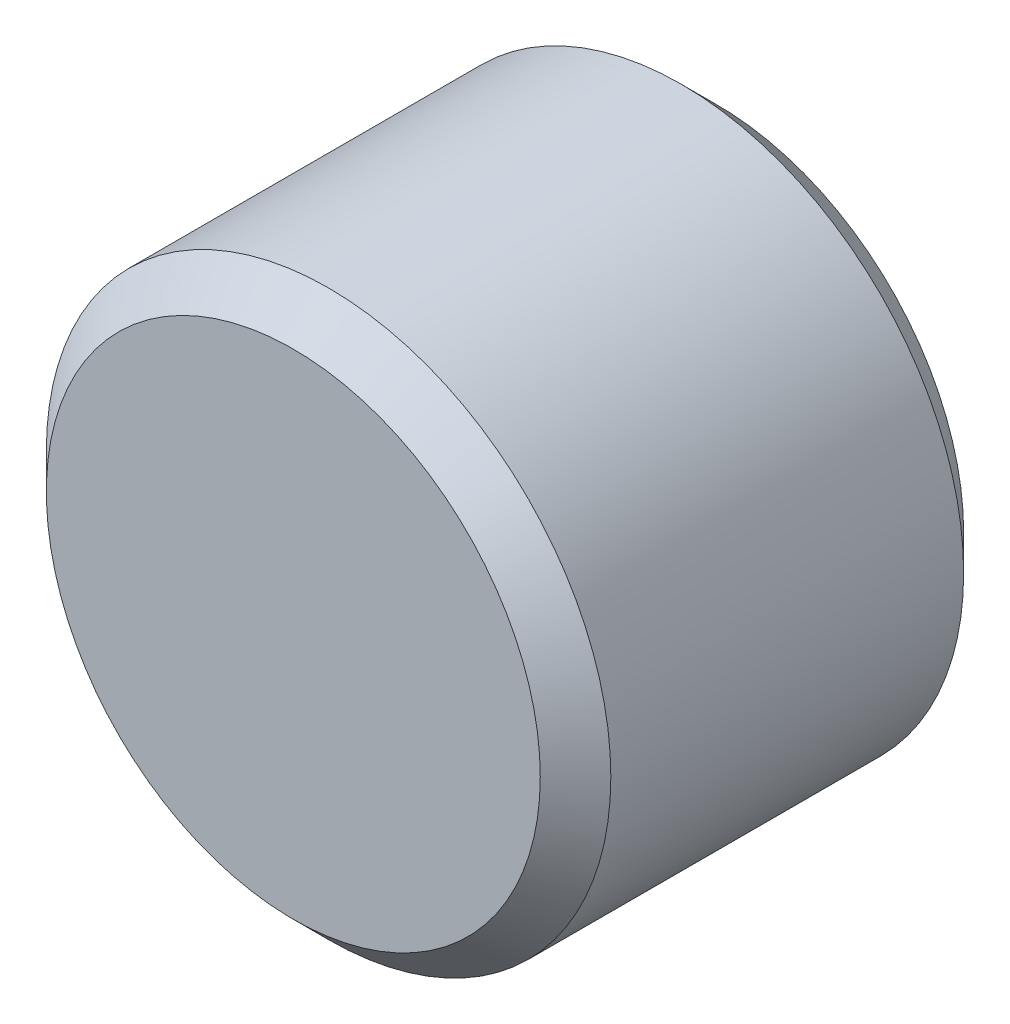
ISO-10303-21;
HEADER;
FILE_DESCRIPTION(('STEP AP214'),'2;1');
FILE_NAME('part.step','',(''),(''),'','','');
FILE_SCHEMA(('AUTOMOTIVE_DESIGN { 1 0 10303 214 1 1 1 1 }'));
ENDSEC;
DATA;
#1=APPLICATION_CONTEXT('core data for automotive mechanical design processes');
#2=APPLICATION_PROTOCOL_DEFINITION('international standard','automotive_design',2000,#1);
#3=PRODUCT_CONTEXT('',#1,'mechanical');
#4=PRODUCT('Part','Part','',(#3));
#5=PRODUCT_RELATED_PRODUCT_CATEGORY('part','',(#4));
#6=PRODUCT_DEFINITION_FORMATION('','',#4);
#7=PRODUCT_DEFINITION_CONTEXT('part definition',#1,'design');
#8=PRODUCT_DEFINITION('design','',#6,#7);
#9=PRODUCT_DEFINITION_SHAPE('','',#8);
#10=(LENGTH_UNIT() NAMED_UNIT(*) SI_UNIT(.MILLI.,.METRE.));
#11=(NAMED_UNIT(*) PLANE_ANGLE_UNIT() SI_UNIT($,.RADIAN.));
#12=(NAMED_UNIT(*) SI_UNIT($,.STERADIAN.) SOLID_ANGLE_UNIT());
#13=UNCERTAINTY_MEASURE_WITH_UNIT(LENGTH_MEASURE(1.E-05),#10,'distance_accuracy_value','');
#14=(GEOMETRIC_REPRESENTATION_CONTEXT(3) GLOBAL_UNCERTAINTY_ASSIGNED_CONTEXT((#13)) GLOBAL_UNIT_ASSIGNED_CONTEXT((#10,
#11,#12)) REPRESENTATION_CONTEXT('',''));
#15=CARTESIAN_POINT('',(0.,0.,0.));
#16=DIRECTION('',(0.,0.,1.));
#17=DIRECTION('',(1.,0.,0.));
#18=AXIS2_PLACEMENT_3D('',#15,#16,#17);
#19=CARTESIAN_POINT('',(0.,0.,6.));
#20=DIRECTION('',(0.,0.,-1.));
#21=DIRECTION('',(-1.,0.,0.));
#22=AXIS2_PLACEMENT_3D('',#19,#20,#21);
#23=CYLINDRICAL_SURFACE('',#22,4.);
#24=CARTESIAN_POINT('',(0.,0.,0.500000000000001));
#25=DIRECTION('',(0.,0.,1.));
#26=DIRECTION('',(1.,0.,0.));
#27=AXIS2_PLACEMENT_3D('',#24,#25,#26);
#28=CIRCLE('',#27,4.);
#29=CARTESIAN_POINT('',(4.,0.,0.500000000000001));
#30=VERTEX_POINT('',#29);
#31=EDGE_CURVE('E51',#30,#30,#28,.T.);
#32=ORIENTED_EDGE('',*,*,#31,.T.);
#33=EDGE_LOOP('',(#32));
#34=FACE_BOUND('',#33,.T.);
#35=CARTESIAN_POINT('',(0.,0.,5.5));
#36=DIRECTION('',(0.,0.,1.));
#37=DIRECTION('',(1.,0.,0.));
#38=AXIS2_PLACEMENT_3D('',#35,#36,#37);
#39=CIRCLE('',#38,4.);
#40=CARTESIAN_POINT('',(4.,0.,5.5));
#41=VERTEX_POINT('',#40);
#42=EDGE_CURVE('E55',#41,#41,#39,.F.);
#43=ORIENTED_EDGE('',*,*,#42,.T.);
#44=EDGE_LOOP('',(#43));
#45=FACE_BOUND('',#44,.T.);
#46=ADVANCED_FACE('F39',(#34,#45),#23,.T.);
#47=CARTESIAN_POINT('',(0.,0.,6.));
#48=DIRECTION('',(0.,0.,1.));
#49=DIRECTION('',(1.,0.,0.));
#50=AXIS2_PLACEMENT_3D('',#47,#48,#49);
#51=PLANE('',#50);
#52=CARTESIAN_POINT('',(0.,0.,6.));
#53=DIRECTION('',(0.,0.,1.));
#54=DIRECTION('',(1.,0.,0.));
#55=AXIS2_PLACEMENT_3D('',#52,#53,#54);
#56=CIRCLE('',#55,3.5);
#57=CARTESIAN_POINT('',(3.5,0.,6.));
#58=VERTEX_POINT('',#57);
#59=EDGE_CURVE('E10',#58,#58,#56,.T.);
#60=ORIENTED_EDGE('',*,*,#59,.T.);
#61=EDGE_LOOP('',(#60));
#62=FACE_BOUND('',#61,.T.);
#63=ADVANCED_FACE('F71',(#62),#51,.T.);
#64=CARTESIAN_POINT('',(0.,0.,0.));
#65=DIRECTION('',(0.,0.,1.));
#66=DIRECTION('',(1.,0.,0.));
#67=AXIS2_PLACEMENT_3D('',#64,#65,#66);
#68=PLANE('',#67);
#69=CARTESIAN_POINT('',(0.,0.,0.));
#70=DIRECTION('',(0.,0.,1.));
#71=DIRECTION('',(1.,0.,0.));
#72=AXIS2_PLACEMENT_3D('',#69,#70,#71);
#73=CIRCLE('',#72,3.5);
#74=CARTESIAN_POINT('',(3.5,0.,0.));
#75=VERTEX_POINT('',#74);
#76=EDGE_CURVE('E47',#75,#75,#73,.F.);
#77=ORIENTED_EDGE('',*,*,#76,.T.);
#78=EDGE_LOOP('',(#77));
#79=FACE_BOUND('',#78,.T.);
#80=ADVANCED_FACE('F68',(#79),#68,.F.);
#81=CARTESIAN_POINT('',(0.,0.,0.500000000000001));
#82=DIRECTION('',(0.,0.,1.));
#83=DIRECTION('',(1.,0.,0.));
#84=AXIS2_PLACEMENT_3D('',#81,#82,#83);
#85=CONICAL_SURFACE('',#84,4.,0.785398163397451);
#86=ORIENTED_EDGE('',*,*,#76,.F.);
#87=EDGE_LOOP('',(#86));
#88=FACE_BOUND('',#87,.T.);
#89=ORIENTED_EDGE('',*,*,#31,.F.);
#90=EDGE_LOOP('',(#89));
#91=FACE_BOUND('',#90,.T.);
#92=ADVANCED_FACE('F64',(#88,#91),#85,.T.);
#93=CARTESIAN_POINT('',(0.,0.,6.));
#94=DIRECTION('',(0.,0.,-1.));
#95=DIRECTION('',(-1.,0.,0.));
#96=AXIS2_PLACEMENT_3D('',#93,#94,#95);
#97=CONICAL_SURFACE('',#96,3.5,0.785398163397447);
#98=ORIENTED_EDGE('',*,*,#42,.F.);
#99=EDGE_LOOP('',(#98));
#100=FACE_BOUND('',#99,.T.);
#101=ORIENTED_EDGE('',*,*,#59,.F.);
#102=EDGE_LOOP('',(#101));
#103=FACE_BOUND('',#102,.T.);
#104=ADVANCED_FACE('F42',(#100,#103),#97,.T.);
#105=CLOSED_SHELL('',(#46,#63,#80,#92,#104));
#106=MANIFOLD_SOLID_BREP('B2',#105);
#107=ADVANCED_BREP_SHAPE_REPRESENTATION('',(#18,#106),#14);
#108=SHAPE_DEFINITION_REPRESENTATION(#9,#107);
ENDSEC;
END-ISO-10303-21;
